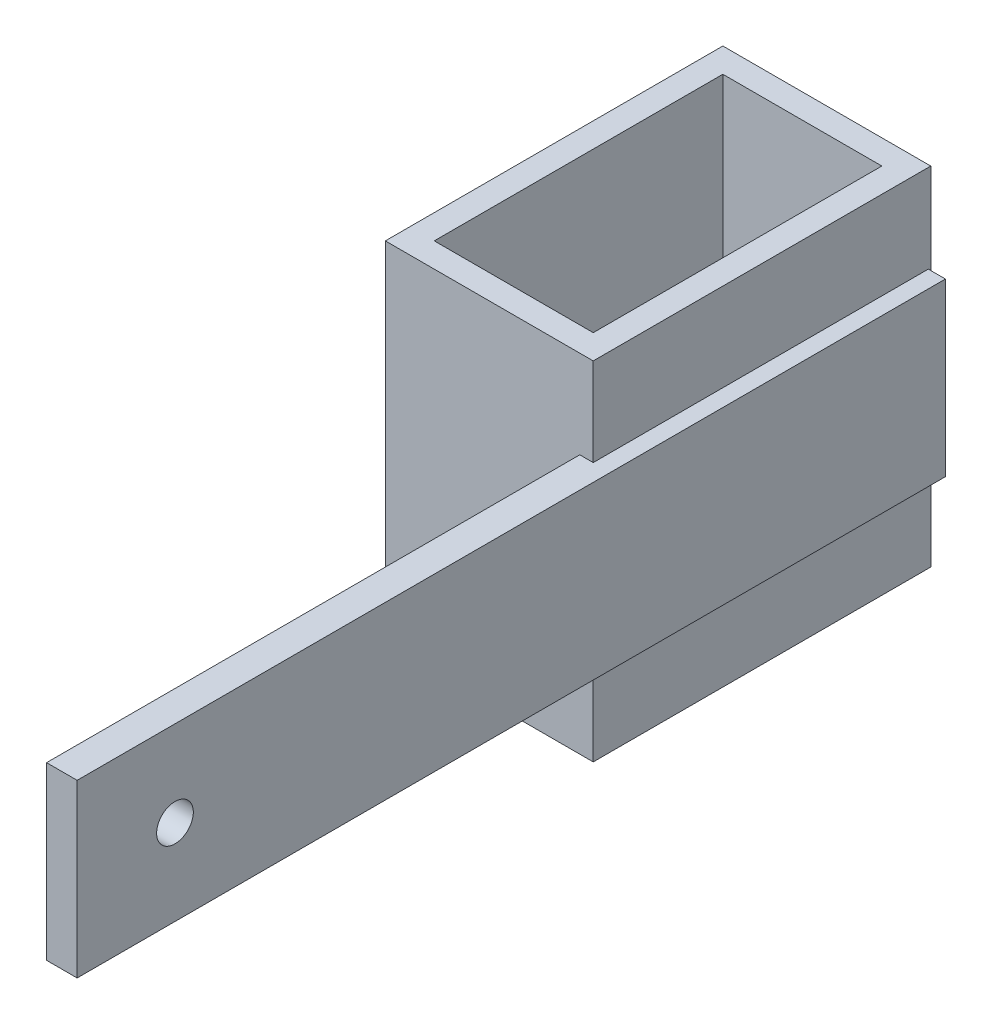
ISO-10303-21;
HEADER;
FILE_DESCRIPTION(('STEP AP214'),'2;1');
FILE_NAME('part.step','',(''),(''),'','','');
FILE_SCHEMA(('AUTOMOTIVE_DESIGN { 1 0 10303 214 1 1 1 1 }'));
ENDSEC;
DATA;
#1=APPLICATION_CONTEXT('core data for automotive mechanical design processes');
#2=APPLICATION_PROTOCOL_DEFINITION('international standard','automotive_design',2000,#1);
#3=PRODUCT_CONTEXT('',#1,'mechanical');
#4=PRODUCT('Part','Part','',(#3));
#5=PRODUCT_RELATED_PRODUCT_CATEGORY('part','',(#4));
#6=PRODUCT_DEFINITION_FORMATION('','',#4);
#7=PRODUCT_DEFINITION_CONTEXT('part definition',#1,'design');
#8=PRODUCT_DEFINITION('design','',#6,#7);
#9=PRODUCT_DEFINITION_SHAPE('','',#8);
#10=(LENGTH_UNIT() NAMED_UNIT(*) SI_UNIT(.MILLI.,.METRE.));
#11=(NAMED_UNIT(*) PLANE_ANGLE_UNIT() SI_UNIT($,.RADIAN.));
#12=(NAMED_UNIT(*) SI_UNIT($,.STERADIAN.) SOLID_ANGLE_UNIT());
#13=UNCERTAINTY_MEASURE_WITH_UNIT(LENGTH_MEASURE(1.E-05),#10,'distance_accuracy_value','');
#14=(GEOMETRIC_REPRESENTATION_CONTEXT(3) GLOBAL_UNCERTAINTY_ASSIGNED_CONTEXT((#13)) GLOBAL_UNIT_ASSIGNED_CONTEXT((#10,
#11,#12)) REPRESENTATION_CONTEXT('',''));
#15=CARTESIAN_POINT('',(0.,0.,0.));
#16=DIRECTION('',(0.,0.,1.));
#17=DIRECTION('',(1.,0.,0.));
#18=AXIS2_PLACEMENT_3D('',#15,#16,#17);
#19=CARTESIAN_POINT('',(15.4,-7.,8.00000000000001));
#20=DIRECTION('',(0.,1.,0.));
#21=DIRECTION('',(0.,0.,1.));
#22=AXIS2_PLACEMENT_3D('',#19,#20,#21);
#23=PLANE('',#22);
#24=DIRECTION('',(0.,0.,1.));
#25=VECTOR('',#24,1.);
#26=CARTESIAN_POINT('',(16.5,-7.,8.00000000000001));
#27=LINE('',#26,#25);
#28=CARTESIAN_POINT('',(16.5,-7.,-63.));
#29=VERTEX_POINT('',#28);
#30=CARTESIAN_POINT('',(16.5,-7.,-35.6));
#31=VERTEX_POINT('',#30);
#32=EDGE_CURVE('E198',#29,#31,#27,.T.);
#33=ORIENTED_EDGE('',*,*,#32,.F.);
#34=DIRECTION('',(1.,0.,0.));
#35=VECTOR('',#34,1.);
#36=CARTESIAN_POINT('',(15.4,-7.,-63.));
#37=LINE('',#36,#35);
#38=CARTESIAN_POINT('',(17.9,-7.,-63.));
#39=VERTEX_POINT('',#38);
#40=EDGE_CURVE('E181',#29,#39,#37,.T.);
#41=ORIENTED_EDGE('',*,*,#40,.T.);
#42=DIRECTION('',(0.,0.,-1.));
#43=VECTOR('',#42,1.);
#44=CARTESIAN_POINT('',(17.9,-7.,8.00000000000001));
#45=LINE('',#44,#43);
#46=CARTESIAN_POINT('',(17.9,-7.,8.00000000000001));
#47=VERTEX_POINT('',#46);
#48=EDGE_CURVE('E170',#47,#39,#45,.T.);
#49=ORIENTED_EDGE('',*,*,#48,.F.);
#50=DIRECTION('',(1.,0.,0.));
#51=VECTOR('',#50,1.);
#52=CARTESIAN_POINT('',(15.4,-7.,8.00000000000001));
#53=LINE('',#52,#51);
#54=CARTESIAN_POINT('',(15.4,-7.,8.00000000000001));
#55=VERTEX_POINT('',#54);
#56=EDGE_CURVE('E188',#55,#47,#53,.T.);
#57=ORIENTED_EDGE('',*,*,#56,.F.);
#58=DIRECTION('',(0.,0.,-1.));
#59=VECTOR('',#58,1.);
#60=CARTESIAN_POINT('',(15.4,-7.,8.00000000000001));
#61=LINE('',#60,#59);
#62=CARTESIAN_POINT('',(15.4,-7.,-35.6));
#63=VERTEX_POINT('',#62);
#64=EDGE_CURVE('E163',#55,#63,#61,.T.);
#65=ORIENTED_EDGE('',*,*,#64,.T.);
#66=DIRECTION('',(1.,0.,0.));
#67=VECTOR('',#66,1.);
#68=CARTESIAN_POINT('',(15.4,-7.,-35.6));
#69=LINE('',#68,#67);
#70=EDGE_CURVE('E183',#63,#31,#69,.T.);
#71=ORIENTED_EDGE('',*,*,#70,.T.);
#72=EDGE_LOOP('',(#33,#41,#49,#57,#65,#71));
#73=FACE_BOUND('',#72,.T.);
#74=ADVANCED_FACE('F39',(#73),#23,.F.);
#75=CARTESIAN_POINT('',(17.9,7.,8.00000000000001));
#76=DIRECTION('',(0.,-1.,0.));
#77=DIRECTION('',(0.,0.,-1.));
#78=AXIS2_PLACEMENT_3D('',#75,#76,#77);
#79=PLANE('',#78);
#80=DIRECTION('',(0.,0.,-1.));
#81=VECTOR('',#80,1.);
#82=CARTESIAN_POINT('',(16.5,7.,8.00000000000001));
#83=LINE('',#82,#81);
#84=CARTESIAN_POINT('',(16.5,7.,-35.6));
#85=VERTEX_POINT('',#84);
#86=CARTESIAN_POINT('',(16.5,7.,-63.));
#87=VERTEX_POINT('',#86);
#88=EDGE_CURVE('E200',#85,#87,#83,.T.);
#89=ORIENTED_EDGE('',*,*,#88,.F.);
#90=DIRECTION('',(-1.,0.,0.));
#91=VECTOR('',#90,1.);
#92=CARTESIAN_POINT('',(17.9,7.,-35.6));
#93=LINE('',#92,#91);
#94=CARTESIAN_POINT('',(15.4,7.,-35.6));
#95=VERTEX_POINT('',#94);
#96=EDGE_CURVE('E145',#85,#95,#93,.T.);
#97=ORIENTED_EDGE('',*,*,#96,.T.);
#98=DIRECTION('',(0.,0.,-1.));
#99=VECTOR('',#98,1.);
#100=CARTESIAN_POINT('',(15.4,7.,8.00000000000001));
#101=LINE('',#100,#99);
#102=CARTESIAN_POINT('',(15.4,7.,8.00000000000001));
#103=VERTEX_POINT('',#102);
#104=EDGE_CURVE('E172',#103,#95,#101,.T.);
#105=ORIENTED_EDGE('',*,*,#104,.F.);
#106=DIRECTION('',(-1.,0.,0.));
#107=VECTOR('',#106,1.);
#108=CARTESIAN_POINT('',(17.9,7.,8.00000000000001));
#109=LINE('',#108,#107);
#110=CARTESIAN_POINT('',(17.9,7.,8.00000000000001));
#111=VERTEX_POINT('',#110);
#112=EDGE_CURVE('E178',#111,#103,#109,.T.);
#113=ORIENTED_EDGE('',*,*,#112,.F.);
#114=DIRECTION('',(0.,0.,-1.));
#115=VECTOR('',#114,1.);
#116=CARTESIAN_POINT('',(17.9,7.,8.00000000000001));
#117=LINE('',#116,#115);
#118=CARTESIAN_POINT('',(17.9,7.,-63.));
#119=VERTEX_POINT('',#118);
#120=EDGE_CURVE('E168',#111,#119,#117,.T.);
#121=ORIENTED_EDGE('',*,*,#120,.T.);
#122=DIRECTION('',(-1.,0.,0.));
#123=VECTOR('',#122,1.);
#124=CARTESIAN_POINT('',(17.9,7.,-63.));
#125=LINE('',#124,#123);
#126=EDGE_CURVE('E180',#119,#87,#125,.T.);
#127=ORIENTED_EDGE('',*,*,#126,.T.);
#128=EDGE_LOOP('',(#89,#97,#105,#113,#121,#127));
#129=FACE_BOUND('',#128,.T.);
#130=ADVANCED_FACE('F267',(#129),#79,.F.);
#131=CARTESIAN_POINT('',(0.,0.,-63.));
#132=DIRECTION('',(0.,0.,1.));
#133=DIRECTION('',(1.,0.,0.));
#134=AXIS2_PLACEMENT_3D('',#131,#132,#133);
#135=PLANE('',#134);
#136=DIRECTION('',(0.,-1.,0.));
#137=VECTOR('',#136,1.);
#138=CARTESIAN_POINT('',(16.5,0.,-63.));
#139=LINE('',#138,#137);
#140=EDGE_CURVE('E161',#87,#29,#139,.T.);
#141=ORIENTED_EDGE('',*,*,#140,.F.);
#142=ORIENTED_EDGE('',*,*,#126,.F.);
#143=DIRECTION('',(0.,1.,0.));
#144=VECTOR('',#143,1.);
#145=CARTESIAN_POINT('',(17.9,-7.,-63.));
#146=LINE('',#145,#144);
#147=EDGE_CURVE('E182',#39,#119,#146,.T.);
#148=ORIENTED_EDGE('',*,*,#147,.F.);
#149=ORIENTED_EDGE('',*,*,#40,.F.);
#150=EDGE_LOOP('',(#141,#142,#148,#149));
#151=FACE_BOUND('',#150,.T.);
#152=ADVANCED_FACE('F271',(#151),#135,.F.);
#153=CARTESIAN_POINT('',(15.4,7.,8.00000000000001));
#154=DIRECTION('',(1.,0.,0.));
#155=DIRECTION('',(0.,0.,-1.));
#156=AXIS2_PLACEMENT_3D('',#153,#154,#155);
#157=PLANE('',#156);
#158=CARTESIAN_POINT('',(15.4,0.,0.));
#159=DIRECTION('',(1.,0.,0.));
#160=DIRECTION('',(0.,0.,-1.));
#161=AXIS2_PLACEMENT_3D('',#158,#159,#160);
#162=CIRCLE('',#161,1.5);
#163=CARTESIAN_POINT('',(15.4,0.,-1.5));
#164=VERTEX_POINT('',#163);
#165=EDGE_CURVE('E153',#164,#164,#162,.F.);
#166=ORIENTED_EDGE('',*,*,#165,.F.);
#167=EDGE_LOOP('',(#166));
#168=FACE_BOUND('',#167,.T.);
#169=ORIENTED_EDGE('',*,*,#104,.T.);
#170=DIRECTION('',(0.,-1.,0.));
#171=VECTOR('',#170,1.);
#172=CARTESIAN_POINT('',(15.4,7.,-35.6));
#173=LINE('',#172,#171);
#174=EDGE_CURVE('E194',#95,#63,#173,.T.);
#175=ORIENTED_EDGE('',*,*,#174,.T.);
#176=ORIENTED_EDGE('',*,*,#64,.F.);
#177=DIRECTION('',(0.,-1.,0.));
#178=VECTOR('',#177,1.);
#179=CARTESIAN_POINT('',(15.4,7.,8.00000000000001));
#180=LINE('',#179,#178);
#181=EDGE_CURVE('E177',#103,#55,#180,.T.);
#182=ORIENTED_EDGE('',*,*,#181,.F.);
#183=EDGE_LOOP('',(#169,#175,#176,#182));
#184=FACE_BOUND('',#183,.T.);
#185=ADVANCED_FACE('F41',(#168,#184),#157,.F.);
#186=CARTESIAN_POINT('',(17.9,-7.,8.00000000000001));
#187=DIRECTION('',(-1.,0.,0.));
#188=DIRECTION('',(0.,0.,1.));
#189=AXIS2_PLACEMENT_3D('',#186,#187,#188);
#190=PLANE('',#189);
#191=CARTESIAN_POINT('',(17.9,0.,0.));
#192=DIRECTION('',(-1.,0.,0.));
#193=DIRECTION('',(0.,0.,1.));
#194=AXIS2_PLACEMENT_3D('',#191,#192,#193);
#195=CIRCLE('',#194,1.5);
#196=CARTESIAN_POINT('',(17.9,0.,1.5));
#197=VERTEX_POINT('',#196);
#198=EDGE_CURVE('E43',#197,#197,#195,.F.);
#199=ORIENTED_EDGE('',*,*,#198,.F.);
#200=EDGE_LOOP('',(#199));
#201=FACE_BOUND('',#200,.T.);
#202=ORIENTED_EDGE('',*,*,#147,.T.);
#203=ORIENTED_EDGE('',*,*,#120,.F.);
#204=DIRECTION('',(0.,1.,0.));
#205=VECTOR('',#204,1.);
#206=CARTESIAN_POINT('',(17.9,-7.,8.00000000000001));
#207=LINE('',#206,#205);
#208=EDGE_CURVE('E190',#47,#111,#207,.T.);
#209=ORIENTED_EDGE('',*,*,#208,.F.);
#210=ORIENTED_EDGE('',*,*,#48,.T.);
#211=EDGE_LOOP('',(#202,#203,#209,#210));
#212=FACE_BOUND('',#211,.T.);
#213=ADVANCED_FACE('F258',(#201,#212),#190,.F.);
#214=CARTESIAN_POINT('',(0.,0.,8.00000000000001));
#215=DIRECTION('',(0.,0.,1.));
#216=DIRECTION('',(1.,0.,0.));
#217=AXIS2_PLACEMENT_3D('',#214,#215,#216);
#218=PLANE('',#217);
#219=ORIENTED_EDGE('',*,*,#181,.T.);
#220=ORIENTED_EDGE('',*,*,#56,.T.);
#221=ORIENTED_EDGE('',*,*,#208,.T.);
#222=ORIENTED_EDGE('',*,*,#112,.T.);
#223=EDGE_LOOP('',(#219,#220,#221,#222));
#224=FACE_BOUND('',#223,.T.);
#225=ADVANCED_FACE('F259',(#224),#218,.T.);
#226=CARTESIAN_POINT('',(0.,0.,-35.6));
#227=DIRECTION('',(0.,0.,1.));
#228=DIRECTION('',(1.,0.,0.));
#229=AXIS2_PLACEMENT_3D('',#226,#227,#228);
#230=PLANE('',#229);
#231=ORIENTED_EDGE('',*,*,#70,.F.);
#232=ORIENTED_EDGE('',*,*,#174,.F.);
#233=ORIENTED_EDGE('',*,*,#96,.F.);
#234=DIRECTION('',(0.,1.,0.));
#235=VECTOR('',#234,1.);
#236=CARTESIAN_POINT('',(16.5,-14.2,-35.6));
#237=LINE('',#236,#235);
#238=CARTESIAN_POINT('',(16.5,14.2,-35.6));
#239=VERTEX_POINT('',#238);
#240=EDGE_CURVE('E228',#85,#239,#237,.T.);
#241=ORIENTED_EDGE('',*,*,#240,.T.);
#242=DIRECTION('',(-1.,0.,0.));
#243=VECTOR('',#242,1.);
#244=CARTESIAN_POINT('',(16.5,14.2,-35.6));
#245=LINE('',#244,#243);
#246=CARTESIAN_POINT('',(-0.5,14.2,-35.6));
#247=VERTEX_POINT('',#246);
#248=EDGE_CURVE('E212',#239,#247,#245,.T.);
#249=ORIENTED_EDGE('',*,*,#248,.T.);
#250=DIRECTION('',(0.,-1.,0.));
#251=VECTOR('',#250,1.);
#252=CARTESIAN_POINT('',(-0.5,14.2,-35.6));
#253=LINE('',#252,#251);
#254=CARTESIAN_POINT('',(-0.5,-14.2,-35.6));
#255=VERTEX_POINT('',#254);
#256=EDGE_CURVE('E220',#247,#255,#253,.T.);
#257=ORIENTED_EDGE('',*,*,#256,.T.);
#258=DIRECTION('',(1.,0.,0.));
#259=VECTOR('',#258,1.);
#260=CARTESIAN_POINT('',(-0.5,-14.2,-35.6));
#261=LINE('',#260,#259);
#262=CARTESIAN_POINT('',(16.5,-14.2,-35.6));
#263=VERTEX_POINT('',#262);
#264=EDGE_CURVE('E229',#255,#263,#261,.T.);
#265=ORIENTED_EDGE('',*,*,#264,.T.);
#266=EDGE_CURVE('E226',#263,#31,#237,.T.);
#267=ORIENTED_EDGE('',*,*,#266,.T.);
#268=EDGE_LOOP('',(#231,#232,#233,#241,#249,#257,#265,#267));
#269=FACE_BOUND('',#268,.T.);
#270=ADVANCED_FACE('F285',(#269),#230,.T.);
#271=CARTESIAN_POINT('',(16.5,-14.2,-35.6));
#272=DIRECTION('',(-1.,0.,0.));
#273=DIRECTION('',(0.,0.,1.));
#274=AXIS2_PLACEMENT_3D('',#271,#272,#273);
#275=PLANE('',#274);
#276=ORIENTED_EDGE('',*,*,#140,.T.);
#277=ORIENTED_EDGE('',*,*,#32,.T.);
#278=ORIENTED_EDGE('',*,*,#266,.F.);
#279=DIRECTION('',(0.,0.,-1.));
#280=VECTOR('',#279,1.);
#281=CARTESIAN_POINT('',(16.5,-14.2,-35.6));
#282=LINE('',#281,#280);
#283=CARTESIAN_POINT('',(16.5,-14.2,-63.2));
#284=VERTEX_POINT('',#283);
#285=EDGE_CURVE('E202',#263,#284,#282,.T.);
#286=ORIENTED_EDGE('',*,*,#285,.T.);
#287=DIRECTION('',(0.,1.,0.));
#288=VECTOR('',#287,1.);
#289=CARTESIAN_POINT('',(16.5,-14.2,-63.2));
#290=LINE('',#289,#288);
#291=CARTESIAN_POINT('',(16.5,14.2,-63.2));
#292=VERTEX_POINT('',#291);
#293=EDGE_CURVE('E217',#284,#292,#290,.T.);
#294=ORIENTED_EDGE('',*,*,#293,.T.);
#295=DIRECTION('',(0.,0.,-1.));
#296=VECTOR('',#295,1.);
#297=CARTESIAN_POINT('',(16.5,14.2,-35.6));
#298=LINE('',#297,#296);
#299=EDGE_CURVE('E208',#239,#292,#298,.T.);
#300=ORIENTED_EDGE('',*,*,#299,.F.);
#301=ORIENTED_EDGE('',*,*,#240,.F.);
#302=ORIENTED_EDGE('',*,*,#88,.T.);
#303=EDGE_LOOP('',(#276,#277,#278,#286,#294,#300,#301,#302));
#304=FACE_BOUND('',#303,.T.);
#305=ADVANCED_FACE('F273',(#304),#275,.F.);
#306=CARTESIAN_POINT('',(-0.5,14.2,-35.6));
#307=DIRECTION('',(1.,0.,0.));
#308=DIRECTION('',(0.,0.,-1.));
#309=AXIS2_PLACEMENT_3D('',#306,#307,#308);
#310=PLANE('',#309);
#311=DIRECTION('',(0.,-1.,0.));
#312=VECTOR('',#311,1.);
#313=CARTESIAN_POINT('',(-0.5,14.2,-63.2));
#314=LINE('',#313,#312);
#315=CARTESIAN_POINT('',(-0.5,14.2,-63.2));
#316=VERTEX_POINT('',#315);
#317=CARTESIAN_POINT('',(-0.5,-14.2,-63.2));
#318=VERTEX_POINT('',#317);
#319=EDGE_CURVE('E225',#316,#318,#314,.T.);
#320=ORIENTED_EDGE('',*,*,#319,.T.);
#321=DIRECTION('',(0.,0.,-1.));
#322=VECTOR('',#321,1.);
#323=CARTESIAN_POINT('',(-0.5,-14.2,-35.6));
#324=LINE('',#323,#322);
#325=EDGE_CURVE('E205',#255,#318,#324,.T.);
#326=ORIENTED_EDGE('',*,*,#325,.F.);
#327=ORIENTED_EDGE('',*,*,#256,.F.);
#328=DIRECTION('',(0.,0.,-1.));
#329=VECTOR('',#328,1.);
#330=CARTESIAN_POINT('',(-0.5,14.2,-35.6));
#331=LINE('',#330,#329);
#332=EDGE_CURVE('E211',#247,#316,#331,.T.);
#333=ORIENTED_EDGE('',*,*,#332,.T.);
#334=EDGE_LOOP('',(#320,#326,#327,#333));
#335=FACE_BOUND('',#334,.T.);
#336=ADVANCED_FACE('F387',(#335),#310,.F.);
#337=CARTESIAN_POINT('',(-0.5,-14.2,-35.6));
#338=DIRECTION('',(0.,1.,0.));
#339=DIRECTION('',(0.,0.,1.));
#340=AXIS2_PLACEMENT_3D('',#337,#338,#339);
#341=PLANE('',#340);
#342=DIRECTION('',(0.,0.,-1.));
#343=VECTOR('',#342,1.);
#344=CARTESIAN_POINT('',(1.5,-14.2,-35.6));
#345=LINE('',#344,#343);
#346=CARTESIAN_POINT('',(1.5,-14.2,-37.6));
#347=VERTEX_POINT('',#346);
#348=CARTESIAN_POINT('',(1.5,-14.2,-61.2));
#349=VERTEX_POINT('',#348);
#350=EDGE_CURVE('E151',#347,#349,#345,.T.);
#351=ORIENTED_EDGE('',*,*,#350,.F.);
#352=DIRECTION('',(1.,0.,0.));
#353=VECTOR('',#352,1.);
#354=CARTESIAN_POINT('',(-0.5,-14.2,-37.6));
#355=LINE('',#354,#353);
#356=CARTESIAN_POINT('',(14.5,-14.2,-37.6));
#357=VERTEX_POINT('',#356);
#358=EDGE_CURVE('E240',#347,#357,#355,.T.);
#359=ORIENTED_EDGE('',*,*,#358,.T.);
#360=DIRECTION('',(0.,0.,1.));
#361=VECTOR('',#360,1.);
#362=CARTESIAN_POINT('',(14.5,-14.2,-35.6));
#363=LINE('',#362,#361);
#364=CARTESIAN_POINT('',(14.5,-14.2,-61.2));
#365=VERTEX_POINT('',#364);
#366=EDGE_CURVE('E232',#365,#357,#363,.T.);
#367=ORIENTED_EDGE('',*,*,#366,.F.);
#368=DIRECTION('',(1.,0.,0.));
#369=VECTOR('',#368,1.);
#370=CARTESIAN_POINT('',(-0.5,-14.2,-61.2));
#371=LINE('',#370,#369);
#372=EDGE_CURVE('E238',#349,#365,#371,.T.);
#373=ORIENTED_EDGE('',*,*,#372,.F.);
#374=EDGE_LOOP('',(#351,#359,#367,#373));
#375=FACE_BOUND('',#374,.T.);
#376=DIRECTION('',(1.,0.,0.));
#377=VECTOR('',#376,1.);
#378=CARTESIAN_POINT('',(-0.5,-14.2,-63.2));
#379=LINE('',#378,#377);
#380=EDGE_CURVE('E219',#318,#284,#379,.T.);
#381=ORIENTED_EDGE('',*,*,#380,.T.);
#382=ORIENTED_EDGE('',*,*,#285,.F.);
#383=ORIENTED_EDGE('',*,*,#264,.F.);
#384=ORIENTED_EDGE('',*,*,#325,.T.);
#385=EDGE_LOOP('',(#381,#382,#383,#384));
#386=FACE_BOUND('',#385,.T.);
#387=ADVANCED_FACE('F378',(#375,#386),#341,.F.);
#388=CARTESIAN_POINT('',(16.5,14.2,-35.6));
#389=DIRECTION('',(0.,-1.,0.));
#390=DIRECTION('',(0.,0.,-1.));
#391=AXIS2_PLACEMENT_3D('',#388,#389,#390);
#392=PLANE('',#391);
#393=DIRECTION('',(0.,0.,-1.));
#394=VECTOR('',#393,1.);
#395=CARTESIAN_POINT('',(14.5,14.2,-35.6));
#396=LINE('',#395,#394);
#397=CARTESIAN_POINT('',(14.5,14.2,-37.6));
#398=VERTEX_POINT('',#397);
#399=CARTESIAN_POINT('',(14.5,14.2,-61.2));
#400=VERTEX_POINT('',#399);
#401=EDGE_CURVE('E141',#398,#400,#396,.T.);
#402=ORIENTED_EDGE('',*,*,#401,.F.);
#403=DIRECTION('',(-1.,0.,0.));
#404=VECTOR('',#403,1.);
#405=CARTESIAN_POINT('',(16.5,14.2,-37.6));
#406=LINE('',#405,#404);
#407=CARTESIAN_POINT('',(1.5,14.2,-37.6));
#408=VERTEX_POINT('',#407);
#409=EDGE_CURVE('E11',#398,#408,#406,.T.);
#410=ORIENTED_EDGE('',*,*,#409,.T.);
#411=DIRECTION('',(0.,0.,1.));
#412=VECTOR('',#411,1.);
#413=CARTESIAN_POINT('',(1.5,14.2,-35.6));
#414=LINE('',#413,#412);
#415=CARTESIAN_POINT('',(1.5,14.2,-61.2));
#416=VERTEX_POINT('',#415);
#417=EDGE_CURVE('E48',#416,#408,#414,.T.);
#418=ORIENTED_EDGE('',*,*,#417,.F.);
#419=DIRECTION('',(-1.,0.,0.));
#420=VECTOR('',#419,1.);
#421=CARTESIAN_POINT('',(16.5,14.2,-61.2));
#422=LINE('',#421,#420);
#423=EDGE_CURVE('E136',#400,#416,#422,.T.);
#424=ORIENTED_EDGE('',*,*,#423,.F.);
#425=EDGE_LOOP('',(#402,#410,#418,#424));
#426=FACE_BOUND('',#425,.T.);
#427=DIRECTION('',(-1.,0.,0.));
#428=VECTOR('',#427,1.);
#429=CARTESIAN_POINT('',(16.5,14.2,-63.2));
#430=LINE('',#429,#428);
#431=EDGE_CURVE('E214',#292,#316,#430,.T.);
#432=ORIENTED_EDGE('',*,*,#431,.T.);
#433=ORIENTED_EDGE('',*,*,#332,.F.);
#434=ORIENTED_EDGE('',*,*,#248,.F.);
#435=ORIENTED_EDGE('',*,*,#299,.T.);
#436=EDGE_LOOP('',(#432,#433,#434,#435));
#437=FACE_BOUND('',#436,.T.);
#438=ADVANCED_FACE('F154',(#426,#437),#392,.F.);
#439=CARTESIAN_POINT('',(0.,0.,-63.2));
#440=DIRECTION('',(0.,0.,1.));
#441=DIRECTION('',(1.,0.,0.));
#442=AXIS2_PLACEMENT_3D('',#439,#440,#441);
#443=PLANE('',#442);
#444=ORIENTED_EDGE('',*,*,#319,.F.);
#445=ORIENTED_EDGE('',*,*,#431,.F.);
#446=ORIENTED_EDGE('',*,*,#293,.F.);
#447=ORIENTED_EDGE('',*,*,#380,.F.);
#448=EDGE_LOOP('',(#444,#445,#446,#447));
#449=FACE_BOUND('',#448,.T.);
#450=ADVANCED_FACE('F356',(#449),#443,.F.);
#451=CARTESIAN_POINT('',(1.5,14.3,-37.6));
#452=DIRECTION('',(1.,0.,0.));
#453=DIRECTION('',(0.,0.,-1.));
#454=AXIS2_PLACEMENT_3D('',#451,#452,#453);
#455=PLANE('',#454);
#456=ORIENTED_EDGE('',*,*,#350,.T.);
#457=DIRECTION('',(0.,-1.,0.));
#458=VECTOR('',#457,1.);
#459=CARTESIAN_POINT('',(1.5,14.3,-61.2));
#460=LINE('',#459,#458);
#461=EDGE_CURVE('E54',#416,#349,#460,.T.);
#462=ORIENTED_EDGE('',*,*,#461,.F.);
#463=ORIENTED_EDGE('',*,*,#417,.T.);
#464=DIRECTION('',(0.,-1.,0.));
#465=VECTOR('',#464,1.);
#466=CARTESIAN_POINT('',(1.5,14.3,-37.6));
#467=LINE('',#466,#465);
#468=EDGE_CURVE('E242',#408,#347,#467,.T.);
#469=ORIENTED_EDGE('',*,*,#468,.T.);
#470=EDGE_LOOP('',(#456,#462,#463,#469));
#471=FACE_BOUND('',#470,.T.);
#472=ADVANCED_FACE('F150',(#471),#455,.T.);
#473=CARTESIAN_POINT('',(14.5,-14.3,-37.6));
#474=DIRECTION('',(-1.,0.,0.));
#475=DIRECTION('',(0.,0.,1.));
#476=AXIS2_PLACEMENT_3D('',#473,#474,#475);
#477=PLANE('',#476);
#478=ORIENTED_EDGE('',*,*,#366,.T.);
#479=DIRECTION('',(0.,1.,0.));
#480=VECTOR('',#479,1.);
#481=CARTESIAN_POINT('',(14.5,-14.3,-37.6));
#482=LINE('',#481,#480);
#483=EDGE_CURVE('E245',#357,#398,#482,.T.);
#484=ORIENTED_EDGE('',*,*,#483,.T.);
#485=ORIENTED_EDGE('',*,*,#401,.T.);
#486=DIRECTION('',(0.,1.,0.));
#487=VECTOR('',#486,1.);
#488=CARTESIAN_POINT('',(14.5,-14.3,-61.2));
#489=LINE('',#488,#487);
#490=EDGE_CURVE('E58',#365,#400,#489,.T.);
#491=ORIENTED_EDGE('',*,*,#490,.F.);
#492=EDGE_LOOP('',(#478,#484,#485,#491));
#493=FACE_BOUND('',#492,.T.);
#494=ADVANCED_FACE('F338',(#493),#477,.T.);
#495=CARTESIAN_POINT('',(0.,0.,-37.6));
#496=DIRECTION('',(0.,0.,1.));
#497=DIRECTION('',(1.,0.,0.));
#498=AXIS2_PLACEMENT_3D('',#495,#496,#497);
#499=PLANE('',#498);
#500=ORIENTED_EDGE('',*,*,#468,.F.);
#501=ORIENTED_EDGE('',*,*,#409,.F.);
#502=ORIENTED_EDGE('',*,*,#483,.F.);
#503=ORIENTED_EDGE('',*,*,#358,.F.);
#504=EDGE_LOOP('',(#500,#501,#502,#503));
#505=FACE_BOUND('',#504,.T.);
#506=ADVANCED_FACE('F335',(#505),#499,.F.);
#507=CARTESIAN_POINT('',(0.,0.,-61.2));
#508=DIRECTION('',(0.,0.,1.));
#509=DIRECTION('',(1.,0.,0.));
#510=AXIS2_PLACEMENT_3D('',#507,#508,#509);
#511=PLANE('',#510);
#512=ORIENTED_EDGE('',*,*,#372,.T.);
#513=ORIENTED_EDGE('',*,*,#490,.T.);
#514=ORIENTED_EDGE('',*,*,#423,.T.);
#515=ORIENTED_EDGE('',*,*,#461,.T.);
#516=EDGE_LOOP('',(#512,#513,#514,#515));
#517=FACE_BOUND('',#516,.T.);
#518=ADVANCED_FACE('F139',(#517),#511,.T.);
#519=CARTESIAN_POINT('',(18.,0.,0.));
#520=DIRECTION('',(-1.,0.,0.));
#521=DIRECTION('',(0.,0.,1.));
#522=AXIS2_PLACEMENT_3D('',#519,#520,#521);
#523=CYLINDRICAL_SURFACE('',#522,1.5);
#524=ORIENTED_EDGE('',*,*,#198,.T.);
#525=EDGE_LOOP('',(#524));
#526=FACE_BOUND('',#525,.T.);
#527=ORIENTED_EDGE('',*,*,#165,.T.);
#528=EDGE_LOOP('',(#527));
#529=FACE_BOUND('',#528,.T.);
#530=ADVANCED_FACE('F255',(#526,#529),#523,.F.);
#531=CLOSED_SHELL('',(#74,#130,#152,#185,#213,#225,#270,#305,#336,#387,#438,#450,#472,#494,#506,
#518,#530));
#532=MANIFOLD_SOLID_BREP('B2',#531);
#533=ADVANCED_BREP_SHAPE_REPRESENTATION('',(#18,#532),#14);
#534=SHAPE_DEFINITION_REPRESENTATION(#9,#533);
ENDSEC;
END-ISO-10303-21;
